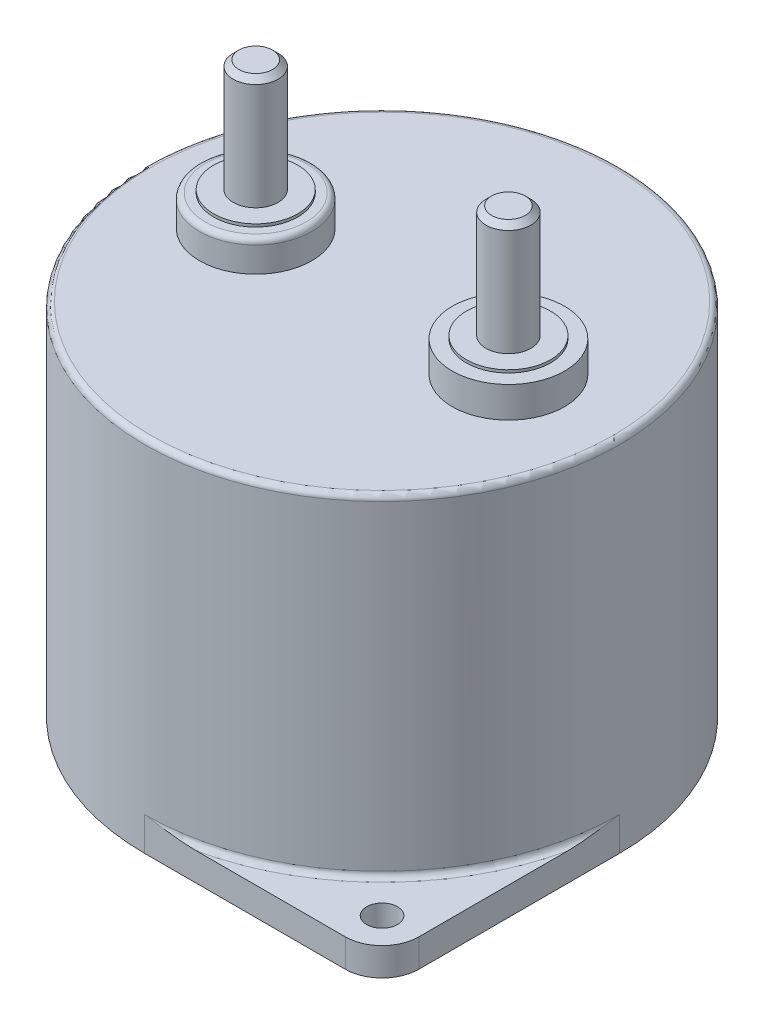
ISO-10303-21;
HEADER;
FILE_DESCRIPTION(('STEP AP214'),'2;1');
FILE_NAME('part.step','',(''),(''),'','','');
FILE_SCHEMA(('AUTOMOTIVE_DESIGN { 1 0 10303 214 1 1 1 1 }'));
ENDSEC;
DATA;
#1=APPLICATION_CONTEXT('core data for automotive mechanical design processes');
#2=APPLICATION_PROTOCOL_DEFINITION('international standard','automotive_design',2000,#1);
#3=PRODUCT_CONTEXT('',#1,'mechanical');
#4=PRODUCT('Part','Part','',(#3));
#5=PRODUCT_RELATED_PRODUCT_CATEGORY('part','',(#4));
#6=PRODUCT_DEFINITION_FORMATION('','',#4);
#7=PRODUCT_DEFINITION_CONTEXT('part definition',#1,'design');
#8=PRODUCT_DEFINITION('design','',#6,#7);
#9=PRODUCT_DEFINITION_SHAPE('','',#8);
#10=(LENGTH_UNIT() NAMED_UNIT(*) SI_UNIT(.MILLI.,.METRE.));
#11=(NAMED_UNIT(*) PLANE_ANGLE_UNIT() SI_UNIT($,.RADIAN.));
#12=(NAMED_UNIT(*) SI_UNIT($,.STERADIAN.) SOLID_ANGLE_UNIT());
#13=UNCERTAINTY_MEASURE_WITH_UNIT(LENGTH_MEASURE(1.E-05),#10,'distance_accuracy_value','');
#14=(GEOMETRIC_REPRESENTATION_CONTEXT(3) GLOBAL_UNCERTAINTY_ASSIGNED_CONTEXT((#13)) GLOBAL_UNIT_ASSIGNED_CONTEXT((#10,
#11,#12)) REPRESENTATION_CONTEXT('',''));
#15=CARTESIAN_POINT('',(0.,0.,0.));
#16=DIRECTION('',(0.,0.,1.));
#17=DIRECTION('',(1.,0.,0.));
#18=AXIS2_PLACEMENT_3D('',#15,#16,#17);
#19=CARTESIAN_POINT('',(0.,64.,0.));
#20=DIRECTION('',(0.,-1.,0.));
#21=DIRECTION('',(0.,0.,-1.));
#22=AXIS2_PLACEMENT_3D('',#19,#20,#21);
#23=CYLINDRICAL_SURFACE('',#22,42.25);
#24=CARTESIAN_POINT('',(0.,63.,0.));
#25=DIRECTION('',(0.,1.,0.));
#26=DIRECTION('',(0.,0.,1.));
#27=AXIS2_PLACEMENT_3D('',#24,#25,#26);
#28=CIRCLE('',#27,42.25);
#29=CARTESIAN_POINT('',(0.,63.,42.25));
#30=VERTEX_POINT('',#29);
#31=EDGE_CURVE('E213',#30,#30,#28,.F.);
#32=ORIENTED_EDGE('',*,*,#31,.T.);
#33=EDGE_LOOP('',(#32));
#34=FACE_BOUND('',#33,.T.);
#35=CARTESIAN_POINT('',(0.,6.,0.));
#36=DIRECTION('',(0.,-1.,0.));
#37=DIRECTION('',(0.,0.,-1.));
#38=AXIS2_PLACEMENT_3D('',#35,#36,#37);
#39=CIRCLE('',#38,42.25);
#40=CARTESIAN_POINT('',(0.,6.,42.25));
#41=VERTEX_POINT('',#40);
#42=CARTESIAN_POINT('',(42.25,6.,0.));
#43=VERTEX_POINT('',#42);
#44=EDGE_CURVE('E210',#41,#43,#39,.F.);
#45=ORIENTED_EDGE('',*,*,#44,.T.);
#46=DIRECTION('',(0.,-1.,0.));
#47=VECTOR('',#46,1.);
#48=CARTESIAN_POINT('',(42.25,5.,0.));
#49=LINE('',#48,#47);
#50=CARTESIAN_POINT('',(42.25,0.,0.));
#51=VERTEX_POINT('',#50);
#52=EDGE_CURVE('E182',#43,#51,#49,.T.);
#53=ORIENTED_EDGE('',*,*,#52,.T.);
#54=CARTESIAN_POINT('',(0.,0.,0.));
#55=DIRECTION('',(0.,1.,0.));
#56=DIRECTION('',(0.,0.,1.));
#57=AXIS2_PLACEMENT_3D('',#54,#55,#56);
#58=CIRCLE('',#57,42.25);
#59=CARTESIAN_POINT('',(0.,0.,-42.25));
#60=VERTEX_POINT('',#59);
#61=EDGE_CURVE('E200',#51,#60,#58,.T.);
#62=ORIENTED_EDGE('',*,*,#61,.T.);
#63=DIRECTION('',(0.,-1.,0.));
#64=VECTOR('',#63,1.);
#65=CARTESIAN_POINT('',(0.,5.,-42.25));
#66=LINE('',#65,#64);
#67=CARTESIAN_POINT('',(0.,6.,-42.25));
#68=VERTEX_POINT('',#67);
#69=EDGE_CURVE('E137',#68,#60,#66,.T.);
#70=ORIENTED_EDGE('',*,*,#69,.F.);
#71=CARTESIAN_POINT('',(0.,6.,0.));
#72=DIRECTION('',(0.,-1.,0.));
#73=DIRECTION('',(0.,0.,-1.));
#74=AXIS2_PLACEMENT_3D('',#71,#72,#73);
#75=CIRCLE('',#74,42.25);
#76=CARTESIAN_POINT('',(-42.25,6.,4.43270420369402E-13));
#77=VERTEX_POINT('',#76);
#78=EDGE_CURVE('E206',#68,#77,#75,.F.);
#79=ORIENTED_EDGE('',*,*,#78,.T.);
#80=DIRECTION('',(0.,-1.,0.));
#81=VECTOR('',#80,1.);
#82=CARTESIAN_POINT('',(-42.25,5.,4.43270420369402E-13));
#83=LINE('',#82,#81);
#84=CARTESIAN_POINT('',(-42.25,0.,4.43270420369402E-13));
#85=VERTEX_POINT('',#84);
#86=EDGE_CURVE('E159',#77,#85,#83,.T.);
#87=ORIENTED_EDGE('',*,*,#86,.T.);
#88=CARTESIAN_POINT('',(0.,0.,42.25));
#89=VERTEX_POINT('',#88);
#90=EDGE_CURVE('E193',#85,#89,#58,.T.);
#91=ORIENTED_EDGE('',*,*,#90,.T.);
#92=DIRECTION('',(0.,-1.,0.));
#93=VECTOR('',#92,1.);
#94=CARTESIAN_POINT('',(0.,5.,42.25));
#95=LINE('',#94,#93);
#96=EDGE_CURVE('E190',#41,#89,#95,.T.);
#97=ORIENTED_EDGE('',*,*,#96,.F.);
#98=EDGE_LOOP('',(#45,#53,#62,#70,#79,#87,#91,#97));
#99=FACE_BOUND('',#98,.T.);
#100=ADVANCED_FACE('F47',(#34,#99),#23,.T.);
#101=CARTESIAN_POINT('',(0.,64.,0.));
#102=DIRECTION('',(0.,1.,0.));
#103=DIRECTION('',(0.,0.,1.));
#104=AXIS2_PLACEMENT_3D('',#101,#102,#103);
#105=PLANE('',#104);
#106=CARTESIAN_POINT('',(0.,64.,0.));
#107=DIRECTION('',(0.,1.,0.));
#108=DIRECTION('',(0.,0.,1.));
#109=AXIS2_PLACEMENT_3D('',#106,#107,#108);
#110=CIRCLE('',#109,41.25);
#111=CARTESIAN_POINT('',(0.,64.,41.25));
#112=VERTEX_POINT('',#111);
#113=EDGE_CURVE('E203',#112,#112,#110,.T.);
#114=ORIENTED_EDGE('',*,*,#113,.T.);
#115=EDGE_LOOP('',(#114));
#116=FACE_BOUND('',#115,.T.);
#117=CARTESIAN_POINT('',(22.5,64.,0.));
#118=DIRECTION('',(0.,1.,0.));
#119=DIRECTION('',(0.,0.,1.));
#120=AXIS2_PLACEMENT_3D('',#117,#118,#119);
#121=CIRCLE('',#120,10.);
#122=CARTESIAN_POINT('',(22.5,64.,10.));
#123=VERTEX_POINT('',#122);
#124=EDGE_CURVE('E718',#123,#123,#121,.T.);
#125=ORIENTED_EDGE('',*,*,#124,.F.);
#126=EDGE_LOOP('',(#125));
#127=FACE_BOUND('',#126,.T.);
#128=CARTESIAN_POINT('',(-22.5,64.,0.));
#129=DIRECTION('',(0.,1.,0.));
#130=DIRECTION('',(0.,0.,1.));
#131=AXIS2_PLACEMENT_3D('',#128,#129,#130);
#132=CIRCLE('',#131,10.);
#133=CARTESIAN_POINT('',(-22.5,64.,10.));
#134=VERTEX_POINT('',#133);
#135=EDGE_CURVE('E721',#134,#134,#132,.T.);
#136=ORIENTED_EDGE('',*,*,#135,.F.);
#137=EDGE_LOOP('',(#136));
#138=FACE_BOUND('',#137,.T.);
#139=ADVANCED_FACE('F309',(#116,#127,#138),#105,.T.);
#140=CARTESIAN_POINT('',(0.,0.,0.));
#141=DIRECTION('',(0.,1.,0.));
#142=DIRECTION('',(0.,0.,1.));
#143=AXIS2_PLACEMENT_3D('',#140,#141,#142);
#144=PLANE('',#143);
#145=ORIENTED_EDGE('',*,*,#61,.F.);
#146=DIRECTION('',(0.,0.,1.));
#147=VECTOR('',#146,1.);
#148=CARTESIAN_POINT('',(42.25,0.,35.7088924499208));
#149=LINE('',#148,#147);
#150=CARTESIAN_POINT('',(42.25,0.,35.7088924499208));
#151=VERTEX_POINT('',#150);
#152=EDGE_CURVE('E170',#51,#151,#149,.T.);
#153=ORIENTED_EDGE('',*,*,#152,.T.);
#154=CARTESIAN_POINT('',(35.7088924499208,0.,35.7088924499205));
#155=DIRECTION('',(0.,-1.,0.));
#156=DIRECTION('',(0.,0.,1.));
#157=AXIS2_PLACEMENT_3D('',#154,#155,#156);
#158=CIRCLE('',#157,6.54110755007936);
#159=CARTESIAN_POINT('',(35.7088924499208,0.,42.2499999999998));
#160=VERTEX_POINT('',#159);
#161=EDGE_CURVE('E185',#151,#160,#158,.T.);
#162=ORIENTED_EDGE('',*,*,#161,.T.);
#163=DIRECTION('',(-1.,0.,0.));
#164=VECTOR('',#163,1.);
#165=CARTESIAN_POINT('',(0.,0.,42.25));
#166=LINE('',#165,#164);
#167=EDGE_CURVE('E176',#160,#89,#166,.T.);
#168=ORIENTED_EDGE('',*,*,#167,.T.);
#169=ORIENTED_EDGE('',*,*,#90,.F.);
#170=DIRECTION('',(0.,0.,-1.));
#171=VECTOR('',#170,1.);
#172=CARTESIAN_POINT('',(-42.2500000000004,0.,-35.7088924499204));
#173=LINE('',#172,#171);
#174=CARTESIAN_POINT('',(-42.2500000000004,0.,-35.7088924499204));
#175=VERTEX_POINT('',#174);
#176=EDGE_CURVE('E145',#85,#175,#173,.T.);
#177=ORIENTED_EDGE('',*,*,#176,.T.);
#178=CARTESIAN_POINT('',(-35.7088924499208,0.,-35.7088924499205));
#179=DIRECTION('',(0.,-1.,0.));
#180=DIRECTION('',(0.,0.,1.));
#181=AXIS2_PLACEMENT_3D('',#178,#179,#180);
#182=CIRCLE('',#181,6.54110755007955);
#183=CARTESIAN_POINT('',(-35.7088924499208,0.,-42.25));
#184=VERTEX_POINT('',#183);
#185=EDGE_CURVE('E130',#175,#184,#182,.T.);
#186=ORIENTED_EDGE('',*,*,#185,.T.);
#187=DIRECTION('',(1.,0.,0.));
#188=VECTOR('',#187,1.);
#189=CARTESIAN_POINT('',(0.,0.,-42.25));
#190=LINE('',#189,#188);
#191=EDGE_CURVE('E143',#184,#60,#190,.T.);
#192=ORIENTED_EDGE('',*,*,#191,.T.);
#193=EDGE_LOOP('',(#145,#153,#162,#168,#169,#177,#186,#192));
#194=FACE_BOUND('',#193,.T.);
#195=CARTESIAN_POINT('',(35.7088924499208,0.,35.7088924499205));
#196=DIRECTION('',(0.,-1.,0.));
#197=DIRECTION('',(0.,0.,-1.));
#198=AXIS2_PLACEMENT_3D('',#195,#196,#197);
#199=CIRCLE('',#198,2.75);
#200=CARTESIAN_POINT('',(35.7088924499208,0.,32.9588924499205));
#201=VERTEX_POINT('',#200);
#202=EDGE_CURVE('E164',#201,#201,#199,.T.);
#203=ORIENTED_EDGE('',*,*,#202,.F.);
#204=EDGE_LOOP('',(#203));
#205=FACE_BOUND('',#204,.T.);
#206=CARTESIAN_POINT('',(-35.7088924499208,0.,-35.7088924499205));
#207=DIRECTION('',(0.,-1.,0.));
#208=DIRECTION('',(0.,0.,-1.));
#209=AXIS2_PLACEMENT_3D('',#206,#207,#208);
#210=CIRCLE('',#209,2.75);
#211=CARTESIAN_POINT('',(-35.7088924499208,0.,-38.4588924499205));
#212=VERTEX_POINT('',#211);
#213=EDGE_CURVE('E161',#212,#212,#210,.T.);
#214=ORIENTED_EDGE('',*,*,#213,.F.);
#215=EDGE_LOOP('',(#214));
#216=FACE_BOUND('',#215,.T.);
#217=ADVANCED_FACE('F141',(#194,#205,#216),#144,.F.);
#218=CARTESIAN_POINT('',(0.,5.,42.25));
#219=DIRECTION('',(0.,0.,1.));
#220=DIRECTION('',(1.,0.,0.));
#221=AXIS2_PLACEMENT_3D('',#218,#219,#220);
#222=PLANE('',#221);
#223=ORIENTED_EDGE('',*,*,#167,.F.);
#224=DIRECTION('',(0.,-1.,0.));
#225=VECTOR('',#224,1.);
#226=CARTESIAN_POINT('',(35.7088924499208,5.,42.2499999999998));
#227=LINE('',#226,#225);
#228=CARTESIAN_POINT('',(35.7088924499208,5.,42.2499999999998));
#229=VERTEX_POINT('',#228);
#230=EDGE_CURVE('E194',#229,#160,#227,.T.);
#231=ORIENTED_EDGE('',*,*,#230,.F.);
#232=DIRECTION('',(-1.,0.,0.));
#233=VECTOR('',#232,1.);
#234=CARTESIAN_POINT('',(0.,5.,42.25));
#235=LINE('',#234,#233);
#236=CARTESIAN_POINT('',(9.24662100445347,5.,42.25));
#237=VERTEX_POINT('',#236);
#238=EDGE_CURVE('E179',#229,#237,#235,.T.);
#239=ORIENTED_EDGE('',*,*,#238,.T.);
#240=CARTESIAN_POINT('',(9.24662100445347,5.,42.25));
#241=CARTESIAN_POINT('',(9.07970134467291,5.00001604692421,42.25));
#242=CARTESIAN_POINT('',(8.91279393300615,5.00190828630082,42.25));
#243=CARTESIAN_POINT('',(8.57906476280246,5.00899423611567,42.25));
#244=CARTESIAN_POINT('',(8.41224299726298,5.01418760962697,42.25));
#245=CARTESIAN_POINT('',(7.91226729438939,5.03403112620939,42.25));
#246=CARTESIAN_POINT('',(7.57928201074687,5.05294643347296,42.25));
#247=CARTESIAN_POINT('',(6.94476376029443,5.09743274671237,42.25));
#248=CARTESIAN_POINT('',(6.64317351906457,5.12222526052687,42.25));
#249=CARTESIAN_POINT('',(6.04052493590967,5.17765501963936,42.25));
#250=CARTESIAN_POINT('',(5.73946661386853,5.20829247895201,42.25));
#251=CARTESIAN_POINT('',(4.83695516607054,5.30719737992039,42.25));
#252=CARTESIAN_POINT('',(4.2362740374388,5.38244884257419,42.25));
#253=CARTESIAN_POINT('',(3.03602619916032,5.54429906227525,42.25));
#254=CARTESIAN_POINT('',(2.43646071851503,5.63090659320241,42.25));
#255=CARTESIAN_POINT('',(1.23813710972127,5.80957461257826,42.25));
#256=CARTESIAN_POINT('',(0.639379003888983,5.90163524871647,42.25));
#257=CARTESIAN_POINT('',(0.0270877155773066,5.99583266185191,42.25));
#258=CARTESIAN_POINT('',(0.01354385737742,5.99791633279734,42.25));
#259=CARTESIAN_POINT('',(0.,6.,42.25));
#260=B_SPLINE_CURVE_WITH_KNOTS('',3,(#240,#241,#242,#243,#244,#245,#246,#247,#248,#249,#250,
#251,#252,#253,#254,#255,#256,#257,#258,#259),.UNSPECIFIED.,.F.,.F.,(4,2,2,2,2,2,2,2,2,4),(0.,
0.500729846832701,1.00140859538047,2.00180383636297,2.90956442386763,3.81735825571315,
5.63327218376356,7.45059747530062,9.26797200900522,9.3090816186669),.UNSPECIFIED.);
#261=EDGE_CURVE('E233',#237,#41,#260,.T.);
#262=ORIENTED_EDGE('',*,*,#261,.T.);
#263=ORIENTED_EDGE('',*,*,#96,.T.);
#264=EDGE_LOOP('',(#223,#231,#239,#262,#263));
#265=FACE_BOUND('',#264,.T.);
#266=ADVANCED_FACE('F296',(#265),#222,.T.);
#267=CARTESIAN_POINT('',(35.7088924499208,5.,35.7088924499205));
#268=DIRECTION('',(0.,-1.,0.));
#269=DIRECTION('',(0.,0.,-1.));
#270=AXIS2_PLACEMENT_3D('',#267,#268,#269);
#271=CYLINDRICAL_SURFACE('',#270,6.54110755007936);
#272=ORIENTED_EDGE('',*,*,#161,.F.);
#273=DIRECTION('',(0.,-1.,0.));
#274=VECTOR('',#273,1.);
#275=CARTESIAN_POINT('',(42.25,5.,35.7088924499208));
#276=LINE('',#275,#274);
#277=CARTESIAN_POINT('',(42.25,5.,35.7088924499208));
#278=VERTEX_POINT('',#277);
#279=EDGE_CURVE('E196',#278,#151,#276,.T.);
#280=ORIENTED_EDGE('',*,*,#279,.F.);
#281=CARTESIAN_POINT('',(35.7088924499208,5.,35.7088924499205));
#282=DIRECTION('',(0.,-1.,0.));
#283=DIRECTION('',(0.,0.,1.));
#284=AXIS2_PLACEMENT_3D('',#281,#282,#283);
#285=CIRCLE('',#284,6.54110755007936);
#286=EDGE_CURVE('E175',#278,#229,#285,.T.);
#287=ORIENTED_EDGE('',*,*,#286,.T.);
#288=ORIENTED_EDGE('',*,*,#230,.T.);
#289=EDGE_LOOP('',(#272,#280,#287,#288));
#290=FACE_BOUND('',#289,.T.);
#291=ADVANCED_FACE('F299',(#290),#271,.T.);
#292=CARTESIAN_POINT('',(42.25,5.,35.7088924499208));
#293=DIRECTION('',(1.,0.,0.));
#294=DIRECTION('',(0.,0.,-1.));
#295=AXIS2_PLACEMENT_3D('',#292,#293,#294);
#296=PLANE('',#295);
#297=ORIENTED_EDGE('',*,*,#152,.F.);
#298=ORIENTED_EDGE('',*,*,#52,.F.);
#299=CARTESIAN_POINT('',(42.25,5.,9.24662100445348));
#300=CARTESIAN_POINT('',(42.25,5.00001604692421,9.07970134467292));
#301=CARTESIAN_POINT('',(42.25,5.00190828630082,8.91279393300615));
#302=CARTESIAN_POINT('',(42.25,5.00899423611567,8.57906476280247));
#303=CARTESIAN_POINT('',(42.25,5.01418760962697,8.41224299726299));
#304=CARTESIAN_POINT('',(42.25,5.03403112620939,7.9122672943894));
#305=CARTESIAN_POINT('',(42.25,5.05294643347295,7.57928201074688));
#306=CARTESIAN_POINT('',(42.25,5.09743274671237,6.94476376029444));
#307=CARTESIAN_POINT('',(42.25,5.12222526052687,6.64317351906458));
#308=CARTESIAN_POINT('',(42.25,5.17765501963937,6.04052493590967));
#309=CARTESIAN_POINT('',(42.25,5.20829247895201,5.73946661386854));
#310=CARTESIAN_POINT('',(42.25,5.30719737992039,4.83695516607055));
#311=CARTESIAN_POINT('',(42.25,5.38244884257418,4.23627403743881));
#312=CARTESIAN_POINT('',(42.25,5.54429906227526,3.03602619916033));
#313=CARTESIAN_POINT('',(42.25,5.63090659320244,2.43646071851504));
#314=CARTESIAN_POINT('',(42.25,5.80957461257823,1.23813710972127));
#315=CARTESIAN_POINT('',(42.25,5.90163524871635,0.639379003888973));
#316=CARTESIAN_POINT('',(42.25,5.9958326618519,0.0270877155773154));
#317=CARTESIAN_POINT('',(42.25,5.99791633279733,0.0135438573774285));
#318=CARTESIAN_POINT('',(42.25,6.,0.));
#319=B_SPLINE_CURVE_WITH_KNOTS('',3,(#299,#300,#301,#302,#303,#304,#305,#306,#307,#308,#309,
#310,#311,#312,#313,#314,#315,#316,#317,#318),.UNSPECIFIED.,.F.,.F.,(4,2,2,2,2,2,2,2,2,4),(0.,
0.500729846832697,1.00140859538047,2.00180383636297,2.90956442386763,3.81735825571314,
5.63327218376357,7.45059747530062,9.26797200900522,9.3090816186669),.UNSPECIFIED.);
#320=CARTESIAN_POINT('',(42.25,5.,9.24662100445348));
#321=VERTEX_POINT('',#320);
#322=EDGE_CURVE('E225',#43,#321,#319,.F.);
#323=ORIENTED_EDGE('',*,*,#322,.T.);
#324=DIRECTION('',(0.,0.,1.));
#325=VECTOR('',#324,1.);
#326=CARTESIAN_POINT('',(42.25,5.,35.7088924499208));
#327=LINE('',#326,#325);
#328=EDGE_CURVE('E173',#321,#278,#327,.T.);
#329=ORIENTED_EDGE('',*,*,#328,.T.);
#330=ORIENTED_EDGE('',*,*,#279,.T.);
#331=EDGE_LOOP('',(#297,#298,#323,#329,#330));
#332=FACE_BOUND('',#331,.T.);
#333=ADVANCED_FACE('F240',(#332),#296,.T.);
#334=CARTESIAN_POINT('',(0.,5.,0.));
#335=DIRECTION('',(0.,-1.,0.));
#336=DIRECTION('',(0.,0.,-1.));
#337=AXIS2_PLACEMENT_3D('',#334,#335,#336);
#338=PLANE('',#337);
#339=CARTESIAN_POINT('',(35.7088924499208,5.,35.7088924499205));
#340=DIRECTION('',(0.,-1.,0.));
#341=DIRECTION('',(0.,0.,-1.));
#342=AXIS2_PLACEMENT_3D('',#339,#340,#341);
#343=CIRCLE('',#342,2.75);
#344=CARTESIAN_POINT('',(35.7088924499208,5.,32.9588924499205));
#345=VERTEX_POINT('',#344);
#346=EDGE_CURVE('E167',#345,#345,#343,.T.);
#347=ORIENTED_EDGE('',*,*,#346,.T.);
#348=EDGE_LOOP('',(#347));
#349=FACE_BOUND('',#348,.T.);
#350=ORIENTED_EDGE('',*,*,#328,.F.);
#351=CARTESIAN_POINT('',(0.,5.,0.));
#352=DIRECTION('',(0.,-1.,0.));
#353=DIRECTION('',(0.,0.,-1.));
#354=AXIS2_PLACEMENT_3D('',#351,#352,#353);
#355=CIRCLE('',#354,43.25);
#356=EDGE_CURVE('E216',#321,#237,#355,.T.);
#357=ORIENTED_EDGE('',*,*,#356,.T.);
#358=ORIENTED_EDGE('',*,*,#238,.F.);
#359=ORIENTED_EDGE('',*,*,#286,.F.);
#360=EDGE_LOOP('',(#350,#357,#358,#359));
#361=FACE_BOUND('',#360,.T.);
#362=ADVANCED_FACE('F292',(#349,#361),#338,.F.);
#363=CARTESIAN_POINT('',(35.7088924499208,5.,35.7088924499205));
#364=DIRECTION('',(0.,-1.,0.));
#365=DIRECTION('',(0.,0.,-1.));
#366=AXIS2_PLACEMENT_3D('',#363,#364,#365);
#367=CYLINDRICAL_SURFACE('',#366,2.75);
#368=ORIENTED_EDGE('',*,*,#346,.F.);
#369=EDGE_LOOP('',(#368));
#370=FACE_BOUND('',#369,.T.);
#371=ORIENTED_EDGE('',*,*,#202,.T.);
#372=EDGE_LOOP('',(#371));
#373=FACE_BOUND('',#372,.T.);
#374=ADVANCED_FACE('F279',(#370,#373),#367,.F.);
#375=CARTESIAN_POINT('',(0.,5.,-42.25));
#376=DIRECTION('',(0.,0.,-1.));
#377=DIRECTION('',(-1.,0.,0.));
#378=AXIS2_PLACEMENT_3D('',#375,#376,#377);
#379=PLANE('',#378);
#380=ORIENTED_EDGE('',*,*,#191,.F.);
#381=DIRECTION('',(0.,-1.,0.));
#382=VECTOR('',#381,1.);
#383=CARTESIAN_POINT('',(-35.7088924499208,5.,-42.25));
#384=LINE('',#383,#382);
#385=CARTESIAN_POINT('',(-35.7088924499208,5.,-42.25));
#386=VERTEX_POINT('',#385);
#387=EDGE_CURVE('E126',#386,#184,#384,.T.);
#388=ORIENTED_EDGE('',*,*,#387,.F.);
#389=DIRECTION('',(1.,0.,0.));
#390=VECTOR('',#389,1.);
#391=CARTESIAN_POINT('',(0.,5.,-42.25));
#392=LINE('',#391,#390);
#393=CARTESIAN_POINT('',(-9.24662100445347,5.,-42.25));
#394=VERTEX_POINT('',#393);
#395=EDGE_CURVE('E157',#386,#394,#392,.T.);
#396=ORIENTED_EDGE('',*,*,#395,.T.);
#397=CARTESIAN_POINT('',(-9.24662100445347,5.,-42.25));
#398=CARTESIAN_POINT('',(-9.07970134467291,5.00001604692421,-42.25));
#399=CARTESIAN_POINT('',(-8.91279393300615,5.00190828630082,-42.25));
#400=CARTESIAN_POINT('',(-8.57906476280246,5.00899423611567,-42.25));
#401=CARTESIAN_POINT('',(-8.41224299726298,5.01418760962697,-42.25));
#402=CARTESIAN_POINT('',(-7.91226729438939,5.03403112620939,-42.25));
#403=CARTESIAN_POINT('',(-7.57928201074687,5.05294643347296,-42.25));
#404=CARTESIAN_POINT('',(-6.94476376029443,5.09743274671237,-42.25));
#405=CARTESIAN_POINT('',(-6.64317351906457,5.12222526052687,-42.25));
#406=CARTESIAN_POINT('',(-6.04052493590967,5.17765501963936,-42.25));
#407=CARTESIAN_POINT('',(-5.73946661386853,5.20829247895201,-42.25));
#408=CARTESIAN_POINT('',(-4.83695516607054,5.30719737992039,-42.25));
#409=CARTESIAN_POINT('',(-4.2362740374388,5.38244884257419,-42.25));
#410=CARTESIAN_POINT('',(-3.03602619916032,5.54429906227525,-42.25));
#411=CARTESIAN_POINT('',(-2.43646071851503,5.63090659320241,-42.25));
#412=CARTESIAN_POINT('',(-1.23813710972127,5.80957461257826,-42.25));
#413=CARTESIAN_POINT('',(-0.639379003888983,5.90163524871647,-42.25));
#414=CARTESIAN_POINT('',(-0.0270877155773066,5.99583266185191,-42.25));
#415=CARTESIAN_POINT('',(-0.01354385737742,5.99791633279734,-42.25));
#416=CARTESIAN_POINT('',(0.,6.,-42.25));
#417=B_SPLINE_CURVE_WITH_KNOTS('',3,(#397,#398,#399,#400,#401,#402,#403,#404,#405,#406,#407,
#408,#409,#410,#411,#412,#413,#414,#415,#416),.UNSPECIFIED.,.F.,.F.,(4,2,2,2,2,2,2,2,2,4),(0.,
0.500729846832701,1.00140859538047,2.00180383636297,2.90956442386763,3.81735825571315,
5.63327218376356,7.45059747530062,9.26797200900522,9.3090816186669),.UNSPECIFIED.);
#418=EDGE_CURVE('E266',#394,#68,#417,.T.);
#419=ORIENTED_EDGE('',*,*,#418,.T.);
#420=ORIENTED_EDGE('',*,*,#69,.T.);
#421=EDGE_LOOP('',(#380,#388,#396,#419,#420));
#422=FACE_BOUND('',#421,.T.);
#423=ADVANCED_FACE('F148',(#422),#379,.T.);
#424=CARTESIAN_POINT('',(-35.7088924499208,5.,-35.7088924499205));
#425=DIRECTION('',(0.,-1.,0.));
#426=DIRECTION('',(0.,0.,-1.));
#427=AXIS2_PLACEMENT_3D('',#424,#425,#426);
#428=CYLINDRICAL_SURFACE('',#427,6.54110755007955);
#429=ORIENTED_EDGE('',*,*,#185,.F.);
#430=DIRECTION('',(0.,-1.,0.));
#431=VECTOR('',#430,1.);
#432=CARTESIAN_POINT('',(-42.2500000000004,5.,-35.7088924499204));
#433=LINE('',#432,#431);
#434=CARTESIAN_POINT('',(-42.2500000000004,5.,-35.7088924499204));
#435=VERTEX_POINT('',#434);
#436=EDGE_CURVE('E136',#435,#175,#433,.T.);
#437=ORIENTED_EDGE('',*,*,#436,.F.);
#438=CARTESIAN_POINT('',(-35.7088924499208,5.,-35.7088924499205));
#439=DIRECTION('',(0.,-1.,0.));
#440=DIRECTION('',(0.,0.,1.));
#441=AXIS2_PLACEMENT_3D('',#438,#439,#440);
#442=CIRCLE('',#441,6.54110755007955);
#443=EDGE_CURVE('E133',#435,#386,#442,.T.);
#444=ORIENTED_EDGE('',*,*,#443,.T.);
#445=ORIENTED_EDGE('',*,*,#387,.T.);
#446=EDGE_LOOP('',(#429,#437,#444,#445));
#447=FACE_BOUND('',#446,.T.);
#448=ADVANCED_FACE('F128',(#447),#428,.T.);
#449=CARTESIAN_POINT('',(-42.2500000000004,5.,-35.7088924499204));
#450=DIRECTION('',(-1.,0.,0.));
#451=DIRECTION('',(0.,0.,1.));
#452=AXIS2_PLACEMENT_3D('',#449,#450,#451);
#453=PLANE('',#452);
#454=ORIENTED_EDGE('',*,*,#176,.F.);
#455=ORIENTED_EDGE('',*,*,#86,.F.);
#456=CARTESIAN_POINT('',(-42.2500000000001,5.,-9.24662100445302));
#457=CARTESIAN_POINT('',(-42.2500000000001,5.00001604692421,-9.07970134467247));
#458=CARTESIAN_POINT('',(-42.2500000000001,5.00190828630082,-8.91279393300571));
#459=CARTESIAN_POINT('',(-42.2500000000001,5.00899423611567,-8.57906476280203));
#460=CARTESIAN_POINT('',(-42.2500000000001,5.01418760962696,-8.41224299726255));
#461=CARTESIAN_POINT('',(-42.2500000000001,5.03403112620939,-7.91226729438896));
#462=CARTESIAN_POINT('',(-42.2500000000001,5.05294643347296,-7.57928201074643));
#463=CARTESIAN_POINT('',(-42.2500000000001,5.09743274671237,-6.94476376029399));
#464=CARTESIAN_POINT('',(-42.2500000000001,5.12222526052687,-6.64317351906412));
#465=CARTESIAN_POINT('',(-42.2500000000001,5.17765501963937,-6.04052493590922));
#466=CARTESIAN_POINT('',(-42.2500000000001,5.20829247895202,-5.73946661386808));
#467=CARTESIAN_POINT('',(-42.2500000000001,5.30719737992039,-4.83695516607008));
#468=CARTESIAN_POINT('',(-42.2500000000001,5.38244884257414,-4.23627403743833));
#469=CARTESIAN_POINT('',(-42.25,5.54429906227531,-3.03602619915986));
#470=CARTESIAN_POINT('',(-42.25,5.63090659320261,-2.43646071851459));
#471=CARTESIAN_POINT('',(-42.25,5.80957461257807,-1.23813710972078));
#472=CARTESIAN_POINT('',(-42.25,5.90163524871574,-0.63937900388842));
#473=CARTESIAN_POINT('',(-42.25,5.99583266185187,-0.027087715576858));
#474=CARTESIAN_POINT('',(-42.25,5.99791633279732,-0.0135438573769739));
#475=CARTESIAN_POINT('',(-42.25,6.,4.43337369367206E-13));
#476=B_SPLINE_CURVE_WITH_KNOTS('',3,(#456,#457,#458,#459,#460,#461,#462,#463,#464,#465,#466,
#467,#468,#469,#470,#471,#472,#473,#474,#475),.UNSPECIFIED.,.F.,.F.,(4,2,2,2,2,2,2,2,2,4),(0.,
0.50072984683269,1.00140859538045,2.00180383636297,2.90956442386764,3.81735825571315,
5.63327218376359,7.45059747530063,9.26797200900522,9.3090816186669),.UNSPECIFIED.);
#477=CARTESIAN_POINT('',(-42.2500000000001,5.,-9.24662100445302));
#478=VERTEX_POINT('',#477);
#479=EDGE_CURVE('E63',#77,#478,#476,.F.);
#480=ORIENTED_EDGE('',*,*,#479,.T.);
#481=DIRECTION('',(0.,0.,-1.));
#482=VECTOR('',#481,1.);
#483=CARTESIAN_POINT('',(-42.2500000000004,5.,-35.7088924499204));
#484=LINE('',#483,#482);
#485=EDGE_CURVE('E150',#478,#435,#484,.T.);
#486=ORIENTED_EDGE('',*,*,#485,.T.);
#487=ORIENTED_EDGE('',*,*,#436,.T.);
#488=EDGE_LOOP('',(#454,#455,#480,#486,#487));
#489=FACE_BOUND('',#488,.T.);
#490=ADVANCED_FACE('F284',(#489),#453,.T.);
#491=CARTESIAN_POINT('',(0.,5.,0.));
#492=DIRECTION('',(0.,-1.,0.));
#493=DIRECTION('',(0.,0.,-1.));
#494=AXIS2_PLACEMENT_3D('',#491,#492,#493);
#495=PLANE('',#494);
#496=CARTESIAN_POINT('',(-35.7088924499208,5.,-35.7088924499205));
#497=DIRECTION('',(0.,-1.,0.));
#498=DIRECTION('',(0.,0.,-1.));
#499=AXIS2_PLACEMENT_3D('',#496,#497,#498);
#500=CIRCLE('',#499,2.75);
#501=CARTESIAN_POINT('',(-35.7088924499208,5.,-38.4588924499205));
#502=VERTEX_POINT('',#501);
#503=EDGE_CURVE('E156',#502,#502,#500,.T.);
#504=ORIENTED_EDGE('',*,*,#503,.T.);
#505=EDGE_LOOP('',(#504));
#506=FACE_BOUND('',#505,.T.);
#507=ORIENTED_EDGE('',*,*,#485,.F.);
#508=CARTESIAN_POINT('',(0.,5.,0.));
#509=DIRECTION('',(0.,-1.,0.));
#510=DIRECTION('',(0.,0.,-1.));
#511=AXIS2_PLACEMENT_3D('',#508,#509,#510);
#512=CIRCLE('',#511,43.25);
#513=EDGE_CURVE('E70',#478,#394,#512,.T.);
#514=ORIENTED_EDGE('',*,*,#513,.T.);
#515=ORIENTED_EDGE('',*,*,#395,.F.);
#516=ORIENTED_EDGE('',*,*,#443,.F.);
#517=EDGE_LOOP('',(#507,#514,#515,#516));
#518=FACE_BOUND('',#517,.T.);
#519=ADVANCED_FACE('F280',(#506,#518),#495,.F.);
#520=CARTESIAN_POINT('',(-35.7088924499208,5.,-35.7088924499205));
#521=DIRECTION('',(0.,-1.,0.));
#522=DIRECTION('',(0.,0.,-1.));
#523=AXIS2_PLACEMENT_3D('',#520,#521,#522);
#524=CYLINDRICAL_SURFACE('',#523,2.75);
#525=ORIENTED_EDGE('',*,*,#503,.F.);
#526=EDGE_LOOP('',(#525));
#527=FACE_BOUND('',#526,.T.);
#528=ORIENTED_EDGE('',*,*,#213,.T.);
#529=EDGE_LOOP('',(#528));
#530=FACE_BOUND('',#529,.T.);
#531=ADVANCED_FACE('F283',(#527,#530),#524,.F.);
#532=CARTESIAN_POINT('',(-22.5,69.5,0.));
#533=DIRECTION('',(0.,-1.,0.));
#534=DIRECTION('',(0.,0.,-1.));
#535=AXIS2_PLACEMENT_3D('',#532,#533,#534);
#536=CYLINDRICAL_SURFACE('',#535,10.);
#537=CARTESIAN_POINT('',(-22.5,68.5,0.));
#538=DIRECTION('',(0.,1.,0.));
#539=DIRECTION('',(0.,0.,1.));
#540=AXIS2_PLACEMENT_3D('',#537,#538,#539);
#541=CIRCLE('',#540,10.);
#542=CARTESIAN_POINT('',(-22.5,68.5,10.));
#543=VERTEX_POINT('',#542);
#544=EDGE_CURVE('E222',#543,#543,#541,.F.);
#545=ORIENTED_EDGE('',*,*,#544,.T.);
#546=EDGE_LOOP('',(#545));
#547=FACE_BOUND('',#546,.T.);
#548=ORIENTED_EDGE('',*,*,#135,.T.);
#549=EDGE_LOOP('',(#548));
#550=FACE_BOUND('',#549,.T.);
#551=ADVANCED_FACE('F288',(#547,#550),#536,.T.);
#552=CARTESIAN_POINT('',(-22.5,69.5,0.));
#553=DIRECTION('',(0.,1.,0.));
#554=DIRECTION('',(0.,0.,1.));
#555=AXIS2_PLACEMENT_3D('',#552,#553,#554);
#556=PLANE('',#555);
#557=CARTESIAN_POINT('',(-22.5,69.5,0.));
#558=DIRECTION('',(0.,1.,0.));
#559=DIRECTION('',(0.,0.,1.));
#560=AXIS2_PLACEMENT_3D('',#557,#558,#559);
#561=CIRCLE('',#560,9.);
#562=CARTESIAN_POINT('',(-22.5,69.5,9.));
#563=VERTEX_POINT('',#562);
#564=EDGE_CURVE('E219',#563,#563,#561,.T.);
#565=ORIENTED_EDGE('',*,*,#564,.T.);
#566=EDGE_LOOP('',(#565));
#567=FACE_BOUND('',#566,.T.);
#568=CARTESIAN_POINT('',(-22.5,69.5,0.));
#569=DIRECTION('',(0.,1.,0.));
#570=DIRECTION('',(0.,0.,1.));
#571=AXIS2_PLACEMENT_3D('',#568,#569,#570);
#572=CIRCLE('',#571,7.5);
#573=CARTESIAN_POINT('',(-22.5,69.5,7.5));
#574=VERTEX_POINT('',#573);
#575=EDGE_CURVE('E202',#574,#574,#572,.T.);
#576=ORIENTED_EDGE('',*,*,#575,.F.);
#577=EDGE_LOOP('',(#576));
#578=FACE_BOUND('',#577,.T.);
#579=ADVANCED_FACE('F391',(#567,#578),#556,.T.);
#580=CARTESIAN_POINT('',(22.5,69.5,0.));
#581=DIRECTION('',(0.,-1.,0.));
#582=DIRECTION('',(0.,0.,-1.));
#583=AXIS2_PLACEMENT_3D('',#580,#581,#582);
#584=CYLINDRICAL_SURFACE('',#583,10.);
#585=CARTESIAN_POINT('',(22.5,69.5,0.));
#586=DIRECTION('',(0.,1.,0.));
#587=DIRECTION('',(0.,0.,1.));
#588=AXIS2_PLACEMENT_3D('',#585,#586,#587);
#589=CIRCLE('',#588,10.);
#590=CARTESIAN_POINT('',(22.5,69.5,10.));
#591=VERTEX_POINT('',#590);
#592=EDGE_CURVE('E717',#591,#591,#589,.T.);
#593=ORIENTED_EDGE('',*,*,#592,.F.);
#594=EDGE_LOOP('',(#593));
#595=FACE_BOUND('',#594,.T.);
#596=ORIENTED_EDGE('',*,*,#124,.T.);
#597=EDGE_LOOP('',(#596));
#598=FACE_BOUND('',#597,.T.);
#599=ADVANCED_FACE('F401',(#595,#598),#584,.T.);
#600=CARTESIAN_POINT('',(22.5,69.5,0.));
#601=DIRECTION('',(0.,1.,0.));
#602=DIRECTION('',(0.,0.,1.));
#603=AXIS2_PLACEMENT_3D('',#600,#601,#602);
#604=PLANE('',#603);
#605=CARTESIAN_POINT('',(22.5,69.5,0.));
#606=DIRECTION('',(0.,1.,0.));
#607=DIRECTION('',(0.,0.,1.));
#608=AXIS2_PLACEMENT_3D('',#605,#606,#607);
#609=CIRCLE('',#608,7.5);
#610=CARTESIAN_POINT('',(22.5,69.5,7.5));
#611=VERTEX_POINT('',#610);
#612=EDGE_CURVE('E702',#611,#611,#609,.T.);
#613=ORIENTED_EDGE('',*,*,#612,.F.);
#614=EDGE_LOOP('',(#613));
#615=FACE_BOUND('',#614,.T.);
#616=ORIENTED_EDGE('',*,*,#592,.T.);
#617=EDGE_LOOP('',(#616));
#618=FACE_BOUND('',#617,.T.);
#619=ADVANCED_FACE('F411',(#615,#618),#604,.T.);
#620=CARTESIAN_POINT('',(-22.5,97.2132034355964,0.));
#621=DIRECTION('',(0.,-1.,0.));
#622=DIRECTION('',(0.,0.,-1.));
#623=AXIS2_PLACEMENT_3D('',#620,#621,#622);
#624=CYLINDRICAL_SURFACE('',#623,7.5);
#625=ORIENTED_EDGE('',*,*,#575,.T.);
#626=EDGE_LOOP('',(#625));
#627=FACE_BOUND('',#626,.T.);
#628=CARTESIAN_POINT('',(-22.5,70.,0.));
#629=DIRECTION('',(0.,1.,0.));
#630=DIRECTION('',(0.,0.,1.));
#631=AXIS2_PLACEMENT_3D('',#628,#629,#630);
#632=CIRCLE('',#631,7.5);
#633=CARTESIAN_POINT('',(-22.5,70.,7.5));
#634=VERTEX_POINT('',#633);
#635=EDGE_CURVE('E711',#634,#634,#632,.T.);
#636=ORIENTED_EDGE('',*,*,#635,.F.);
#637=EDGE_LOOP('',(#636));
#638=FACE_BOUND('',#637,.T.);
#639=ADVANCED_FACE('F421',(#627,#638),#624,.T.);
#640=CARTESIAN_POINT('',(0.,70.,0.));
#641=DIRECTION('',(0.,1.,0.));
#642=DIRECTION('',(0.,0.,1.));
#643=AXIS2_PLACEMENT_3D('',#640,#641,#642);
#644=PLANE('',#643);
#645=CARTESIAN_POINT('',(-22.5,70.,0.));
#646=DIRECTION('',(0.,1.,0.));
#647=DIRECTION('',(0.,0.,1.));
#648=AXIS2_PLACEMENT_3D('',#645,#646,#647);
#649=CIRCLE('',#648,4.);
#650=CARTESIAN_POINT('',(-22.5,70.,4.));
#651=VERTEX_POINT('',#650);
#652=EDGE_CURVE('E701',#651,#651,#649,.T.);
#653=ORIENTED_EDGE('',*,*,#652,.F.);
#654=EDGE_LOOP('',(#653));
#655=FACE_BOUND('',#654,.T.);
#656=ORIENTED_EDGE('',*,*,#635,.T.);
#657=EDGE_LOOP('',(#656));
#658=FACE_BOUND('',#657,.T.);
#659=ADVANCED_FACE('F431',(#655,#658),#644,.T.);
#660=CARTESIAN_POINT('',(22.5,97.2132034355964,0.));
#661=DIRECTION('',(0.,-1.,0.));
#662=DIRECTION('',(0.,0.,-1.));
#663=AXIS2_PLACEMENT_3D('',#660,#661,#662);
#664=CYLINDRICAL_SURFACE('',#663,7.5);
#665=ORIENTED_EDGE('',*,*,#612,.T.);
#666=EDGE_LOOP('',(#665));
#667=FACE_BOUND('',#666,.T.);
#668=CARTESIAN_POINT('',(22.5,70.,0.));
#669=DIRECTION('',(0.,1.,0.));
#670=DIRECTION('',(0.,0.,1.));
#671=AXIS2_PLACEMENT_3D('',#668,#669,#670);
#672=CIRCLE('',#671,7.5);
#673=CARTESIAN_POINT('',(22.5,70.,7.5));
#674=VERTEX_POINT('',#673);
#675=EDGE_CURVE('E709',#674,#674,#672,.T.);
#676=ORIENTED_EDGE('',*,*,#675,.F.);
#677=EDGE_LOOP('',(#676));
#678=FACE_BOUND('',#677,.T.);
#679=ADVANCED_FACE('F442',(#667,#678),#664,.T.);
#680=CARTESIAN_POINT('',(0.,70.,0.));
#681=DIRECTION('',(0.,1.,0.));
#682=DIRECTION('',(0.,0.,1.));
#683=AXIS2_PLACEMENT_3D('',#680,#681,#682);
#684=PLANE('',#683);
#685=CARTESIAN_POINT('',(22.5,70.,0.));
#686=DIRECTION('',(0.,1.,0.));
#687=DIRECTION('',(0.,0.,1.));
#688=AXIS2_PLACEMENT_3D('',#685,#686,#687);
#689=CIRCLE('',#688,4.);
#690=CARTESIAN_POINT('',(22.5,70.,4.));
#691=VERTEX_POINT('',#690);
#692=EDGE_CURVE('E207',#691,#691,#689,.T.);
#693=ORIENTED_EDGE('',*,*,#692,.F.);
#694=EDGE_LOOP('',(#693));
#695=FACE_BOUND('',#694,.T.);
#696=ORIENTED_EDGE('',*,*,#675,.T.);
#697=EDGE_LOOP('',(#696));
#698=FACE_BOUND('',#697,.T.);
#699=ADVANCED_FACE('F452',(#695,#698),#684,.T.);
#700=CARTESIAN_POINT('',(-22.5,90.,0.));
#701=DIRECTION('',(0.,-1.,0.));
#702=DIRECTION('',(0.,0.,-1.));
#703=AXIS2_PLACEMENT_3D('',#700,#701,#702);
#704=CYLINDRICAL_SURFACE('',#703,4.);
#705=CARTESIAN_POINT('',(-22.5,89.,0.));
#706=DIRECTION('',(0.,1.,0.));
#707=DIRECTION('',(0.,0.,1.));
#708=AXIS2_PLACEMENT_3D('',#705,#706,#707);
#709=CIRCLE('',#708,4.);
#710=CARTESIAN_POINT('',(-22.5,89.,4.));
#711=VERTEX_POINT('',#710);
#712=EDGE_CURVE('E692',#711,#711,#709,.F.);
#713=ORIENTED_EDGE('',*,*,#712,.T.);
#714=EDGE_LOOP('',(#713));
#715=FACE_BOUND('',#714,.T.);
#716=ORIENTED_EDGE('',*,*,#652,.T.);
#717=EDGE_LOOP('',(#716));
#718=FACE_BOUND('',#717,.T.);
#719=ADVANCED_FACE('F461',(#715,#718),#704,.T.);
#720=CARTESIAN_POINT('',(-22.5,90.,0.));
#721=DIRECTION('',(0.,1.,0.));
#722=DIRECTION('',(0.,0.,1.));
#723=AXIS2_PLACEMENT_3D('',#720,#721,#722);
#724=PLANE('',#723);
#725=CARTESIAN_POINT('',(-22.5,90.,0.));
#726=DIRECTION('',(0.,1.,0.));
#727=DIRECTION('',(0.,0.,1.));
#728=AXIS2_PLACEMENT_3D('',#725,#726,#727);
#729=CIRCLE('',#728,3.);
#730=CARTESIAN_POINT('',(-22.5,90.,3.));
#731=VERTEX_POINT('',#730);
#732=EDGE_CURVE('E273',#731,#731,#729,.T.);
#733=ORIENTED_EDGE('',*,*,#732,.T.);
#734=EDGE_LOOP('',(#733));
#735=FACE_BOUND('',#734,.T.);
#736=ADVANCED_FACE('F472',(#735),#724,.T.);
#737=CARTESIAN_POINT('',(22.5,90.,0.));
#738=DIRECTION('',(0.,-1.,0.));
#739=DIRECTION('',(0.,0.,-1.));
#740=AXIS2_PLACEMENT_3D('',#737,#738,#739);
#741=CYLINDRICAL_SURFACE('',#740,4.);
#742=CARTESIAN_POINT('',(22.5,89.,0.));
#743=DIRECTION('',(0.,1.,0.));
#744=DIRECTION('',(0.,0.,1.));
#745=AXIS2_PLACEMENT_3D('',#742,#743,#744);
#746=CIRCLE('',#745,4.);
#747=CARTESIAN_POINT('',(22.5,89.,4.));
#748=VERTEX_POINT('',#747);
#749=EDGE_CURVE('E12',#748,#748,#746,.F.);
#750=ORIENTED_EDGE('',*,*,#749,.T.);
#751=EDGE_LOOP('',(#750));
#752=FACE_BOUND('',#751,.T.);
#753=ORIENTED_EDGE('',*,*,#692,.T.);
#754=EDGE_LOOP('',(#753));
#755=FACE_BOUND('',#754,.T.);
#756=ADVANCED_FACE('F483',(#752,#755),#741,.T.);
#757=CARTESIAN_POINT('',(22.5,90.,0.));
#758=DIRECTION('',(0.,1.,0.));
#759=DIRECTION('',(0.,0.,1.));
#760=AXIS2_PLACEMENT_3D('',#757,#758,#759);
#761=PLANE('',#760);
#762=CARTESIAN_POINT('',(22.5,90.,0.));
#763=DIRECTION('',(0.,1.,0.));
#764=DIRECTION('',(0.,0.,1.));
#765=AXIS2_PLACEMENT_3D('',#762,#763,#764);
#766=CIRCLE('',#765,3.);
#767=CARTESIAN_POINT('',(22.5,90.,3.));
#768=VERTEX_POINT('',#767);
#769=EDGE_CURVE('E56',#768,#768,#766,.T.);
#770=ORIENTED_EDGE('',*,*,#769,.T.);
#771=EDGE_LOOP('',(#770));
#772=FACE_BOUND('',#771,.T.);
#773=ADVANCED_FACE('F493',(#772),#761,.T.);
#774=CARTESIAN_POINT('',(0.,63.,0.));
#775=DIRECTION('',(0.,1.,0.));
#776=DIRECTION('',(0.,0.,1.));
#777=AXIS2_PLACEMENT_3D('',#774,#775,#776);
#778=TOROIDAL_SURFACE('',#777,41.25,1.);
#779=ORIENTED_EDGE('',*,*,#31,.F.);
#780=EDGE_LOOP('',(#779));
#781=FACE_BOUND('',#780,.T.);
#782=ORIENTED_EDGE('',*,*,#113,.F.);
#783=EDGE_LOOP('',(#782));
#784=FACE_BOUND('',#783,.T.);
#785=ADVANCED_FACE('F250',(#781,#784),#778,.T.);
#786=CARTESIAN_POINT('',(0.,6.,0.));
#787=DIRECTION('',(0.,-1.,0.));
#788=DIRECTION('',(0.,0.,-1.));
#789=AXIS2_PLACEMENT_3D('',#786,#787,#788);
#790=TOROIDAL_SURFACE('',#789,43.25,1.);
#791=ORIENTED_EDGE('',*,*,#261,.F.);
#792=ORIENTED_EDGE('',*,*,#356,.F.);
#793=ORIENTED_EDGE('',*,*,#322,.F.);
#794=ORIENTED_EDGE('',*,*,#44,.F.);
#795=EDGE_LOOP('',(#791,#792,#793,#794));
#796=FACE_BOUND('',#795,.T.);
#797=ADVANCED_FACE('F244',(#796),#790,.F.);
#798=CARTESIAN_POINT('',(0.,6.,0.));
#799=DIRECTION('',(0.,-1.,0.));
#800=DIRECTION('',(0.,0.,-1.));
#801=AXIS2_PLACEMENT_3D('',#798,#799,#800);
#802=TOROIDAL_SURFACE('',#801,43.25,1.);
#803=ORIENTED_EDGE('',*,*,#418,.F.);
#804=ORIENTED_EDGE('',*,*,#513,.F.);
#805=ORIENTED_EDGE('',*,*,#479,.F.);
#806=ORIENTED_EDGE('',*,*,#78,.F.);
#807=EDGE_LOOP('',(#803,#804,#805,#806));
#808=FACE_BOUND('',#807,.T.);
#809=ADVANCED_FACE('F249',(#808),#802,.F.);
#810=CARTESIAN_POINT('',(-22.5,68.5,0.));
#811=DIRECTION('',(0.,1.,0.));
#812=DIRECTION('',(0.,0.,1.));
#813=AXIS2_PLACEMENT_3D('',#810,#811,#812);
#814=TOROIDAL_SURFACE('',#813,9.,1.);
#815=ORIENTED_EDGE('',*,*,#544,.F.);
#816=EDGE_LOOP('',(#815));
#817=FACE_BOUND('',#816,.T.);
#818=ORIENTED_EDGE('',*,*,#564,.F.);
#819=EDGE_LOOP('',(#818));
#820=FACE_BOUND('',#819,.T.);
#821=ADVANCED_FACE('F257',(#817,#820),#814,.T.);
#822=CARTESIAN_POINT('',(-22.5,90.,0.));
#823=DIRECTION('',(0.,-1.,0.));
#824=DIRECTION('',(0.,0.,-1.));
#825=AXIS2_PLACEMENT_3D('',#822,#823,#824);
#826=CONICAL_SURFACE('',#825,3.,0.785398163397446);
#827=ORIENTED_EDGE('',*,*,#712,.F.);
#828=EDGE_LOOP('',(#827));
#829=FACE_BOUND('',#828,.T.);
#830=ORIENTED_EDGE('',*,*,#732,.F.);
#831=EDGE_LOOP('',(#830));
#832=FACE_BOUND('',#831,.T.);
#833=ADVANCED_FACE('F531',(#829,#832),#826,.T.);
#834=CARTESIAN_POINT('',(22.5,90.,0.));
#835=DIRECTION('',(0.,-1.,0.));
#836=DIRECTION('',(0.,0.,-1.));
#837=AXIS2_PLACEMENT_3D('',#834,#835,#836);
#838=CONICAL_SURFACE('',#837,3.,0.785398163397446);
#839=ORIENTED_EDGE('',*,*,#749,.F.);
#840=EDGE_LOOP('',(#839));
#841=FACE_BOUND('',#840,.T.);
#842=ORIENTED_EDGE('',*,*,#769,.F.);
#843=EDGE_LOOP('',(#842));
#844=FACE_BOUND('',#843,.T.);
#845=ADVANCED_FACE('F50',(#841,#844),#838,.T.);
#846=CLOSED_SHELL('',(#100,#139,#217,#266,#291,#333,#362,#374,#423,#448,#490,#519,#531,#551,
#579,#599,#619,#639,#659,#679,#699,#719,#736,#756,#773,#785,#797,#809,#821,#833,#845));
#847=MANIFOLD_SOLID_BREP('B2',#846);
#848=ADVANCED_BREP_SHAPE_REPRESENTATION('',(#18,#847),#14);
#849=SHAPE_DEFINITION_REPRESENTATION(#9,#848);
ENDSEC;
END-ISO-10303-21;
